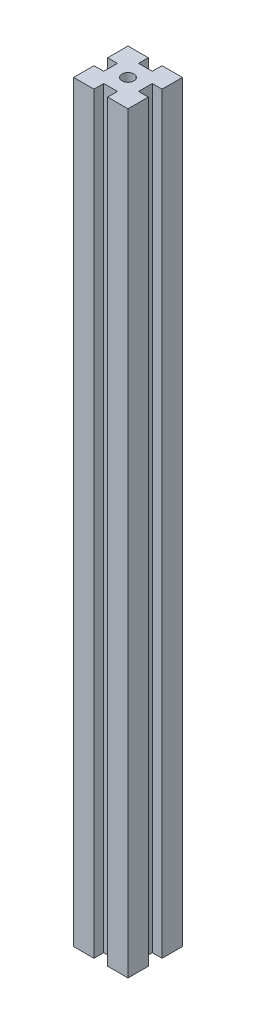
ISO-10303-21;
HEADER;
FILE_DESCRIPTION(('STEP AP214'),'2;1');
FILE_NAME('part.step','',(''),(''),'','','');
FILE_SCHEMA(('AUTOMOTIVE_DESIGN { 1 0 10303 214 1 1 1 1 }'));
ENDSEC;
DATA;
#1=APPLICATION_CONTEXT('core data for automotive mechanical design processes');
#2=APPLICATION_PROTOCOL_DEFINITION('international standard','automotive_design',2000,#1);
#3=PRODUCT_CONTEXT('',#1,'mechanical');
#4=PRODUCT('Part','Part','',(#3));
#5=PRODUCT_RELATED_PRODUCT_CATEGORY('part','',(#4));
#6=PRODUCT_DEFINITION_FORMATION('','',#4);
#7=PRODUCT_DEFINITION_CONTEXT('part definition',#1,'design');
#8=PRODUCT_DEFINITION('design','',#6,#7);
#9=PRODUCT_DEFINITION_SHAPE('','',#8);
#10=(LENGTH_UNIT() NAMED_UNIT(*) SI_UNIT(.MILLI.,.METRE.));
#11=(NAMED_UNIT(*) PLANE_ANGLE_UNIT() SI_UNIT($,.RADIAN.));
#12=(NAMED_UNIT(*) SI_UNIT($,.STERADIAN.) SOLID_ANGLE_UNIT());
#13=UNCERTAINTY_MEASURE_WITH_UNIT(LENGTH_MEASURE(1.E-05),#10,'distance_accuracy_value','');
#14=(GEOMETRIC_REPRESENTATION_CONTEXT(3) GLOBAL_UNCERTAINTY_ASSIGNED_CONTEXT((#13)) GLOBAL_UNIT_ASSIGNED_CONTEXT((#10,
#11,#12)) REPRESENTATION_CONTEXT('',''));
#15=CARTESIAN_POINT('',(0.,0.,0.));
#16=DIRECTION('',(0.,0.,1.));
#17=DIRECTION('',(1.,0.,0.));
#18=AXIS2_PLACEMENT_3D('',#15,#16,#17);
#19=CARTESIAN_POINT('',(0.,346.,0.));
#20=DIRECTION('',(0.,-1.,0.));
#21=DIRECTION('',(0.,0.,-1.));
#22=AXIS2_PLACEMENT_3D('',#19,#20,#21);
#23=PLANE('',#22);
#24=DIRECTION('',(0.,0.,1.));
#25=VECTOR('',#24,1.);
#26=CARTESIAN_POINT('',(0.,346.,0.));
#27=LINE('',#26,#25);
#28=CARTESIAN_POINT('',(1.2490009027033E-13,346.,-9.35000000000006));
#29=VERTEX_POINT('',#28);
#30=CARTESIAN_POINT('',(0.,346.,0.));
#31=VERTEX_POINT('',#30);
#32=EDGE_CURVE('E272',#29,#31,#27,.T.);
#33=ORIENTED_EDGE('',*,*,#32,.T.);
#34=DIRECTION('',(1.,0.,0.));
#35=VECTOR('',#34,1.);
#36=CARTESIAN_POINT('',(0.,346.,0.));
#37=LINE('',#36,#35);
#38=CARTESIAN_POINT('',(9.35000000000014,346.,-1.14491749414469E-13));
#39=VERTEX_POINT('',#38);
#40=EDGE_CURVE('E136',#31,#39,#37,.T.);
#41=ORIENTED_EDGE('',*,*,#40,.T.);
#42=DIRECTION('',(0.,0.,-1.));
#43=VECTOR('',#42,1.);
#44=CARTESIAN_POINT('',(9.34999999999994,346.,-4.49999999999992));
#45=LINE('',#44,#43);
#46=CARTESIAN_POINT('',(9.34999999999994,346.,-4.49999999999992));
#47=VERTEX_POINT('',#46);
#48=EDGE_CURVE('E341',#39,#47,#45,.T.);
#49=ORIENTED_EDGE('',*,*,#48,.T.);
#50=DIRECTION('',(1.,0.,0.));
#51=VECTOR('',#50,1.);
#52=CARTESIAN_POINT('',(15.6500000000002,346.,-4.50000000000007));
#53=LINE('',#52,#51);
#54=CARTESIAN_POINT('',(15.6500000000002,346.,-4.50000000000007));
#55=VERTEX_POINT('',#54);
#56=EDGE_CURVE('E361',#47,#55,#53,.T.);
#57=ORIENTED_EDGE('',*,*,#56,.T.);
#58=DIRECTION('',(0.,0.,1.));
#59=VECTOR('',#58,1.);
#60=CARTESIAN_POINT('',(15.6500000000001,346.,0.));
#61=LINE('',#60,#59);
#62=CARTESIAN_POINT('',(15.6500000000001,346.,0.));
#63=VERTEX_POINT('',#62);
#64=EDGE_CURVE('E357',#55,#63,#61,.T.);
#65=ORIENTED_EDGE('',*,*,#64,.T.);
#66=DIRECTION('',(1.,0.,0.));
#67=VECTOR('',#66,1.);
#68=CARTESIAN_POINT('',(15.6500000000001,346.,0.));
#69=LINE('',#68,#67);
#70=CARTESIAN_POINT('',(25.,346.,0.));
#71=VERTEX_POINT('',#70);
#72=EDGE_CURVE('E360',#63,#71,#69,.T.);
#73=ORIENTED_EDGE('',*,*,#72,.T.);
#74=DIRECTION('',(0.,0.,-1.));
#75=VECTOR('',#74,1.);
#76=CARTESIAN_POINT('',(25.,346.,0.));
#77=LINE('',#76,#75);
#78=CARTESIAN_POINT('',(25.0000000000001,346.,-9.35000000000012));
#79=VERTEX_POINT('',#78);
#80=EDGE_CURVE('E365',#71,#79,#77,.T.);
#81=ORIENTED_EDGE('',*,*,#80,.T.);
#82=DIRECTION('',(-1.,0.,0.));
#83=VECTOR('',#82,1.);
#84=CARTESIAN_POINT('',(20.5000000000001,346.,-9.35000000000013));
#85=LINE('',#84,#83);
#86=CARTESIAN_POINT('',(20.5000000000001,346.,-9.35000000000013));
#87=VERTEX_POINT('',#86);
#88=EDGE_CURVE('E372',#79,#87,#85,.T.);
#89=ORIENTED_EDGE('',*,*,#88,.T.);
#90=DIRECTION('',(0.,0.,-1.));
#91=VECTOR('',#90,1.);
#92=CARTESIAN_POINT('',(20.5000000000001,346.,-15.6500000000001));
#93=LINE('',#92,#91);
#94=CARTESIAN_POINT('',(20.5000000000001,346.,-15.6500000000001));
#95=VERTEX_POINT('',#94);
#96=EDGE_CURVE('E375',#87,#95,#93,.T.);
#97=ORIENTED_EDGE('',*,*,#96,.T.);
#98=DIRECTION('',(1.,0.,0.));
#99=VECTOR('',#98,1.);
#100=CARTESIAN_POINT('',(25.0000000000001,346.,-15.6500000000001));
#101=LINE('',#100,#99);
#102=CARTESIAN_POINT('',(25.0000000000001,346.,-15.6500000000001));
#103=VERTEX_POINT('',#102);
#104=EDGE_CURVE('E378',#95,#103,#101,.T.);
#105=ORIENTED_EDGE('',*,*,#104,.T.);
#106=DIRECTION('',(0.,0.,-1.));
#107=VECTOR('',#106,1.);
#108=CARTESIAN_POINT('',(25.0000000000001,346.,-15.6500000000001));
#109=LINE('',#108,#107);
#110=CARTESIAN_POINT('',(25.,346.,-25.));
#111=VERTEX_POINT('',#110);
#112=EDGE_CURVE('E381',#103,#111,#109,.T.);
#113=ORIENTED_EDGE('',*,*,#112,.T.);
#114=DIRECTION('',(-1.,0.,0.));
#115=VECTOR('',#114,1.);
#116=CARTESIAN_POINT('',(15.65,346.,-25.));
#117=LINE('',#116,#115);
#118=CARTESIAN_POINT('',(15.65,346.,-25.));
#119=VERTEX_POINT('',#118);
#120=EDGE_CURVE('E384',#111,#119,#117,.T.);
#121=ORIENTED_EDGE('',*,*,#120,.T.);
#122=DIRECTION('',(0.,0.,1.));
#123=VECTOR('',#122,1.);
#124=CARTESIAN_POINT('',(15.65,346.,-20.5));
#125=LINE('',#124,#123);
#126=CARTESIAN_POINT('',(15.65,346.,-20.5));
#127=VERTEX_POINT('',#126);
#128=EDGE_CURVE('E387',#119,#127,#125,.T.);
#129=ORIENTED_EDGE('',*,*,#128,.T.);
#130=DIRECTION('',(-1.,0.,0.));
#131=VECTOR('',#130,1.);
#132=CARTESIAN_POINT('',(9.35,346.,-20.5));
#133=LINE('',#132,#131);
#134=CARTESIAN_POINT('',(9.35,346.,-20.5));
#135=VERTEX_POINT('',#134);
#136=EDGE_CURVE('E390',#127,#135,#133,.T.);
#137=ORIENTED_EDGE('',*,*,#136,.T.);
#138=DIRECTION('',(0.,0.,-1.));
#139=VECTOR('',#138,1.);
#140=CARTESIAN_POINT('',(9.35,346.,-25.));
#141=LINE('',#140,#139);
#142=CARTESIAN_POINT('',(9.35,346.,-25.));
#143=VERTEX_POINT('',#142);
#144=EDGE_CURVE('E393',#135,#143,#141,.T.);
#145=ORIENTED_EDGE('',*,*,#144,.T.);
#146=DIRECTION('',(-1.,0.,0.));
#147=VECTOR('',#146,1.);
#148=CARTESIAN_POINT('',(0.,346.,-25.));
#149=LINE('',#148,#147);
#150=CARTESIAN_POINT('',(0.,346.,-25.));
#151=VERTEX_POINT('',#150);
#152=EDGE_CURVE('E396',#143,#151,#149,.T.);
#153=ORIENTED_EDGE('',*,*,#152,.T.);
#154=DIRECTION('',(0.,0.,1.));
#155=VECTOR('',#154,1.);
#156=CARTESIAN_POINT('',(1.90819582357449E-13,346.,-15.6500000000001));
#157=LINE('',#156,#155);
#158=CARTESIAN_POINT('',(1.90819582357449E-13,346.,-15.6500000000001));
#159=VERTEX_POINT('',#158);
#160=EDGE_CURVE('E191',#151,#159,#157,.T.);
#161=ORIENTED_EDGE('',*,*,#160,.T.);
#162=DIRECTION('',(1.,0.,0.));
#163=VECTOR('',#162,1.);
#164=CARTESIAN_POINT('',(4.50000000000019,346.,-15.65));
#165=LINE('',#164,#163);
#166=CARTESIAN_POINT('',(4.50000000000019,346.,-15.65));
#167=VERTEX_POINT('',#166);
#168=EDGE_CURVE('E185',#159,#167,#165,.T.);
#169=ORIENTED_EDGE('',*,*,#168,.T.);
#170=DIRECTION('',(0.,0.,1.));
#171=VECTOR('',#170,1.);
#172=CARTESIAN_POINT('',(4.50000000000013,346.,-9.35000000000002));
#173=LINE('',#172,#171);
#174=CARTESIAN_POINT('',(4.50000000000013,346.,-9.35000000000002));
#175=VERTEX_POINT('',#174);
#176=EDGE_CURVE('E189',#167,#175,#173,.T.);
#177=ORIENTED_EDGE('',*,*,#176,.T.);
#178=DIRECTION('',(-1.,0.,0.));
#179=VECTOR('',#178,1.);
#180=CARTESIAN_POINT('',(1.2490009027033E-13,346.,-9.35000000000006));
#181=LINE('',#180,#179);
#182=EDGE_CURVE('E57',#175,#29,#181,.T.);
#183=ORIENTED_EDGE('',*,*,#182,.T.);
#184=EDGE_LOOP('',(#33,#41,#49,#57,#65,#73,#81,#89,#97,#105,#113,#121,#129,#137,#145,#153,#161,
#169,#177,#183));
#185=FACE_BOUND('',#184,.T.);
#186=CARTESIAN_POINT('',(12.5,346.,-12.5));
#187=DIRECTION('',(0.,1.,0.));
#188=DIRECTION('',(0.,0.,1.));
#189=AXIS2_PLACEMENT_3D('',#186,#187,#188);
#190=CIRCLE('',#189,2.75);
#191=CARTESIAN_POINT('',(12.5,346.,-9.75));
#192=VERTEX_POINT('',#191);
#193=EDGE_CURVE('E218',#192,#192,#190,.T.);
#194=ORIENTED_EDGE('',*,*,#193,.F.);
#195=EDGE_LOOP('',(#194));
#196=FACE_BOUND('',#195,.T.);
#197=ADVANCED_FACE('F39',(#185,#196),#23,.F.);
#198=CARTESIAN_POINT('',(0.,0.,0.));
#199=DIRECTION('',(0.,-1.,0.));
#200=DIRECTION('',(0.,0.,-1.));
#201=AXIS2_PLACEMENT_3D('',#198,#199,#200);
#202=PLANE('',#201);
#203=DIRECTION('',(0.,0.,1.));
#204=VECTOR('',#203,1.);
#205=CARTESIAN_POINT('',(0.,0.,0.));
#206=LINE('',#205,#204);
#207=CARTESIAN_POINT('',(1.2490009027033E-13,0.,-9.35000000000006));
#208=VERTEX_POINT('',#207);
#209=CARTESIAN_POINT('',(0.,0.,0.));
#210=VERTEX_POINT('',#209);
#211=EDGE_CURVE('E213',#208,#210,#206,.T.);
#212=ORIENTED_EDGE('',*,*,#211,.F.);
#213=DIRECTION('',(-1.,0.,0.));
#214=VECTOR('',#213,1.);
#215=CARTESIAN_POINT('',(1.2490009027033E-13,0.,-9.35000000000006));
#216=LINE('',#215,#214);
#217=CARTESIAN_POINT('',(4.50000000000013,0.,-9.35000000000002));
#218=VERTEX_POINT('',#217);
#219=EDGE_CURVE('E128',#218,#208,#216,.T.);
#220=ORIENTED_EDGE('',*,*,#219,.F.);
#221=DIRECTION('',(0.,0.,1.));
#222=VECTOR('',#221,1.);
#223=CARTESIAN_POINT('',(4.50000000000013,0.,-9.35000000000002));
#224=LINE('',#223,#222);
#225=CARTESIAN_POINT('',(4.50000000000019,0.,-15.65));
#226=VERTEX_POINT('',#225);
#227=EDGE_CURVE('E122',#226,#218,#224,.T.);
#228=ORIENTED_EDGE('',*,*,#227,.F.);
#229=DIRECTION('',(1.,0.,0.));
#230=VECTOR('',#229,1.);
#231=CARTESIAN_POINT('',(4.50000000000019,0.,-15.65));
#232=LINE('',#231,#230);
#233=CARTESIAN_POINT('',(1.90819582357449E-13,0.,-15.6500000000001));
#234=VERTEX_POINT('',#233);
#235=EDGE_CURVE('E200',#234,#226,#232,.T.);
#236=ORIENTED_EDGE('',*,*,#235,.F.);
#237=DIRECTION('',(0.,0.,1.));
#238=VECTOR('',#237,1.);
#239=CARTESIAN_POINT('',(1.90819582357449E-13,0.,-15.6500000000001));
#240=LINE('',#239,#238);
#241=CARTESIAN_POINT('',(0.,0.,-25.));
#242=VERTEX_POINT('',#241);
#243=EDGE_CURVE('E263',#242,#234,#240,.T.);
#244=ORIENTED_EDGE('',*,*,#243,.F.);
#245=DIRECTION('',(-1.,0.,0.));
#246=VECTOR('',#245,1.);
#247=CARTESIAN_POINT('',(0.,0.,-25.));
#248=LINE('',#247,#246);
#249=CARTESIAN_POINT('',(9.35,0.,-25.));
#250=VERTEX_POINT('',#249);
#251=EDGE_CURVE('E260',#250,#242,#248,.T.);
#252=ORIENTED_EDGE('',*,*,#251,.F.);
#253=DIRECTION('',(0.,0.,-1.));
#254=VECTOR('',#253,1.);
#255=CARTESIAN_POINT('',(9.35,0.,-25.));
#256=LINE('',#255,#254);
#257=CARTESIAN_POINT('',(9.35,0.,-20.5));
#258=VERTEX_POINT('',#257);
#259=EDGE_CURVE('E257',#258,#250,#256,.T.);
#260=ORIENTED_EDGE('',*,*,#259,.F.);
#261=DIRECTION('',(-1.,0.,0.));
#262=VECTOR('',#261,1.);
#263=CARTESIAN_POINT('',(9.35,0.,-20.5));
#264=LINE('',#263,#262);
#265=CARTESIAN_POINT('',(15.65,0.,-20.5));
#266=VERTEX_POINT('',#265);
#267=EDGE_CURVE('E254',#266,#258,#264,.T.);
#268=ORIENTED_EDGE('',*,*,#267,.F.);
#269=DIRECTION('',(0.,0.,1.));
#270=VECTOR('',#269,1.);
#271=CARTESIAN_POINT('',(15.65,0.,-20.5));
#272=LINE('',#271,#270);
#273=CARTESIAN_POINT('',(15.65,0.,-25.));
#274=VERTEX_POINT('',#273);
#275=EDGE_CURVE('E251',#274,#266,#272,.T.);
#276=ORIENTED_EDGE('',*,*,#275,.F.);
#277=DIRECTION('',(-1.,0.,0.));
#278=VECTOR('',#277,1.);
#279=CARTESIAN_POINT('',(15.65,0.,-25.));
#280=LINE('',#279,#278);
#281=CARTESIAN_POINT('',(25.,0.,-25.));
#282=VERTEX_POINT('',#281);
#283=EDGE_CURVE('E248',#282,#274,#280,.T.);
#284=ORIENTED_EDGE('',*,*,#283,.F.);
#285=DIRECTION('',(0.,0.,-1.));
#286=VECTOR('',#285,1.);
#287=CARTESIAN_POINT('',(25.0000000000001,0.,-15.6500000000001));
#288=LINE('',#287,#286);
#289=CARTESIAN_POINT('',(25.0000000000001,0.,-15.6500000000001));
#290=VERTEX_POINT('',#289);
#291=EDGE_CURVE('E245',#290,#282,#288,.T.);
#292=ORIENTED_EDGE('',*,*,#291,.F.);
#293=DIRECTION('',(1.,0.,0.));
#294=VECTOR('',#293,1.);
#295=CARTESIAN_POINT('',(25.0000000000001,0.,-15.6500000000001));
#296=LINE('',#295,#294);
#297=CARTESIAN_POINT('',(20.5000000000001,0.,-15.6500000000001));
#298=VERTEX_POINT('',#297);
#299=EDGE_CURVE('E242',#298,#290,#296,.T.);
#300=ORIENTED_EDGE('',*,*,#299,.F.);
#301=DIRECTION('',(0.,0.,-1.));
#302=VECTOR('',#301,1.);
#303=CARTESIAN_POINT('',(20.5000000000001,0.,-15.6500000000001));
#304=LINE('',#303,#302);
#305=CARTESIAN_POINT('',(20.5000000000001,0.,-9.35000000000013));
#306=VERTEX_POINT('',#305);
#307=EDGE_CURVE('E239',#306,#298,#304,.T.);
#308=ORIENTED_EDGE('',*,*,#307,.F.);
#309=DIRECTION('',(-1.,0.,0.));
#310=VECTOR('',#309,1.);
#311=CARTESIAN_POINT('',(20.5000000000001,0.,-9.35000000000013));
#312=LINE('',#311,#310);
#313=CARTESIAN_POINT('',(25.0000000000001,0.,-9.35000000000012));
#314=VERTEX_POINT('',#313);
#315=EDGE_CURVE('E236',#314,#306,#312,.T.);
#316=ORIENTED_EDGE('',*,*,#315,.F.);
#317=DIRECTION('',(0.,0.,-1.));
#318=VECTOR('',#317,1.);
#319=CARTESIAN_POINT('',(25.,0.,0.));
#320=LINE('',#319,#318);
#321=CARTESIAN_POINT('',(25.,0.,0.));
#322=VERTEX_POINT('',#321);
#323=EDGE_CURVE('E233',#322,#314,#320,.T.);
#324=ORIENTED_EDGE('',*,*,#323,.F.);
#325=DIRECTION('',(1.,0.,0.));
#326=VECTOR('',#325,1.);
#327=CARTESIAN_POINT('',(15.6500000000001,0.,0.));
#328=LINE('',#327,#326);
#329=CARTESIAN_POINT('',(15.6500000000001,0.,0.));
#330=VERTEX_POINT('',#329);
#331=EDGE_CURVE('E230',#330,#322,#328,.T.);
#332=ORIENTED_EDGE('',*,*,#331,.F.);
#333=DIRECTION('',(0.,0.,1.));
#334=VECTOR('',#333,1.);
#335=CARTESIAN_POINT('',(15.6500000000001,0.,0.));
#336=LINE('',#335,#334);
#337=CARTESIAN_POINT('',(15.6500000000002,0.,-4.50000000000007));
#338=VERTEX_POINT('',#337);
#339=EDGE_CURVE('E227',#338,#330,#336,.T.);
#340=ORIENTED_EDGE('',*,*,#339,.F.);
#341=DIRECTION('',(1.,0.,0.));
#342=VECTOR('',#341,1.);
#343=CARTESIAN_POINT('',(15.6500000000002,0.,-4.50000000000007));
#344=LINE('',#343,#342);
#345=CARTESIAN_POINT('',(9.34999999999994,0.,-4.49999999999992));
#346=VERTEX_POINT('',#345);
#347=EDGE_CURVE('E224',#346,#338,#344,.T.);
#348=ORIENTED_EDGE('',*,*,#347,.F.);
#349=DIRECTION('',(0.,0.,-1.));
#350=VECTOR('',#349,1.);
#351=CARTESIAN_POINT('',(9.34999999999994,0.,-4.49999999999992));
#352=LINE('',#351,#350);
#353=CARTESIAN_POINT('',(9.35000000000014,0.,-1.14491749414469E-13));
#354=VERTEX_POINT('',#353);
#355=EDGE_CURVE('E221',#354,#346,#352,.T.);
#356=ORIENTED_EDGE('',*,*,#355,.F.);
#357=DIRECTION('',(1.,0.,0.));
#358=VECTOR('',#357,1.);
#359=CARTESIAN_POINT('',(0.,0.,0.));
#360=LINE('',#359,#358);
#361=EDGE_CURVE('E217',#210,#354,#360,.T.);
#362=ORIENTED_EDGE('',*,*,#361,.F.);
#363=EDGE_LOOP('',(#212,#220,#228,#236,#244,#252,#260,#268,#276,#284,#292,#300,#308,#316,#324,
#332,#340,#348,#356,#362));
#364=FACE_BOUND('',#363,.T.);
#365=CARTESIAN_POINT('',(12.5,0.,-12.5));
#366=DIRECTION('',(0.,1.,0.));
#367=DIRECTION('',(0.,0.,1.));
#368=AXIS2_PLACEMENT_3D('',#365,#366,#367);
#369=CIRCLE('',#368,2.75);
#370=CARTESIAN_POINT('',(12.5,0.,-9.75));
#371=VERTEX_POINT('',#370);
#372=EDGE_CURVE('E649',#371,#371,#369,.T.);
#373=ORIENTED_EDGE('',*,*,#372,.T.);
#374=EDGE_LOOP('',(#373));
#375=FACE_BOUND('',#374,.T.);
#376=ADVANCED_FACE('F345',(#364,#375),#202,.T.);
#377=CARTESIAN_POINT('',(0.,346.,0.));
#378=DIRECTION('',(1.,0.,0.));
#379=DIRECTION('',(0.,0.,-1.));
#380=AXIS2_PLACEMENT_3D('',#377,#378,#379);
#381=PLANE('',#380);
#382=ORIENTED_EDGE('',*,*,#211,.T.);
#383=DIRECTION('',(0.,-1.,0.));
#384=VECTOR('',#383,1.);
#385=CARTESIAN_POINT('',(0.,346.,0.));
#386=LINE('',#385,#384);
#387=EDGE_CURVE('E11',#31,#210,#386,.T.);
#388=ORIENTED_EDGE('',*,*,#387,.F.);
#389=ORIENTED_EDGE('',*,*,#32,.F.);
#390=DIRECTION('',(0.,-1.,0.));
#391=VECTOR('',#390,1.);
#392=CARTESIAN_POINT('',(1.2490009027033E-13,346.,-9.35000000000006));
#393=LINE('',#392,#391);
#394=EDGE_CURVE('E209',#29,#208,#393,.T.);
#395=ORIENTED_EDGE('',*,*,#394,.T.);
#396=EDGE_LOOP('',(#382,#388,#389,#395));
#397=FACE_BOUND('',#396,.T.);
#398=ADVANCED_FACE('F41',(#397),#381,.F.);
#399=CARTESIAN_POINT('',(0.,346.,0.));
#400=DIRECTION('',(0.,0.,-1.));
#401=DIRECTION('',(-1.,0.,0.));
#402=AXIS2_PLACEMENT_3D('',#399,#400,#401);
#403=PLANE('',#402);
#404=ORIENTED_EDGE('',*,*,#361,.T.);
#405=DIRECTION('',(0.,-1.,0.));
#406=VECTOR('',#405,1.);
#407=CARTESIAN_POINT('',(9.35000000000014,346.,-1.14491749414469E-13));
#408=LINE('',#407,#406);
#409=EDGE_CURVE('E49',#39,#354,#408,.T.);
#410=ORIENTED_EDGE('',*,*,#409,.F.);
#411=ORIENTED_EDGE('',*,*,#40,.F.);
#412=ORIENTED_EDGE('',*,*,#387,.T.);
#413=EDGE_LOOP('',(#404,#410,#411,#412));
#414=FACE_BOUND('',#413,.T.);
#415=ADVANCED_FACE('F432',(#414),#403,.F.);
#416=CARTESIAN_POINT('',(9.34999999999994,346.,-4.49999999999992));
#417=DIRECTION('',(-1.,0.,0.));
#418=DIRECTION('',(0.,0.,1.));
#419=AXIS2_PLACEMENT_3D('',#416,#417,#418);
#420=PLANE('',#419);
#421=ORIENTED_EDGE('',*,*,#355,.T.);
#422=DIRECTION('',(0.,-1.,0.));
#423=VECTOR('',#422,1.);
#424=CARTESIAN_POINT('',(9.34999999999994,346.,-4.49999999999992));
#425=LINE('',#424,#423);
#426=EDGE_CURVE('E331',#47,#346,#425,.T.);
#427=ORIENTED_EDGE('',*,*,#426,.F.);
#428=ORIENTED_EDGE('',*,*,#48,.F.);
#429=ORIENTED_EDGE('',*,*,#409,.T.);
#430=EDGE_LOOP('',(#421,#427,#428,#429));
#431=FACE_BOUND('',#430,.T.);
#432=ADVANCED_FACE('F339',(#431),#420,.F.);
#433=CARTESIAN_POINT('',(15.6500000000002,346.,-4.50000000000007));
#434=DIRECTION('',(0.,0.,-1.));
#435=DIRECTION('',(-1.,0.,0.));
#436=AXIS2_PLACEMENT_3D('',#433,#434,#435);
#437=PLANE('',#436);
#438=ORIENTED_EDGE('',*,*,#347,.T.);
#439=DIRECTION('',(0.,-1.,0.));
#440=VECTOR('',#439,1.);
#441=CARTESIAN_POINT('',(15.6500000000002,346.,-4.50000000000007));
#442=LINE('',#441,#440);
#443=EDGE_CURVE('E327',#55,#338,#442,.T.);
#444=ORIENTED_EDGE('',*,*,#443,.F.);
#445=ORIENTED_EDGE('',*,*,#56,.F.);
#446=ORIENTED_EDGE('',*,*,#426,.T.);
#447=EDGE_LOOP('',(#438,#444,#445,#446));
#448=FACE_BOUND('',#447,.T.);
#449=ADVANCED_FACE('F351',(#448),#437,.F.);
#450=CARTESIAN_POINT('',(15.6500000000001,346.,0.));
#451=DIRECTION('',(1.,0.,0.));
#452=DIRECTION('',(0.,0.,-1.));
#453=AXIS2_PLACEMENT_3D('',#450,#451,#452);
#454=PLANE('',#453);
#455=ORIENTED_EDGE('',*,*,#339,.T.);
#456=DIRECTION('',(0.,-1.,0.));
#457=VECTOR('',#456,1.);
#458=CARTESIAN_POINT('',(15.6500000000001,346.,0.));
#459=LINE('',#458,#457);
#460=EDGE_CURVE('E323',#63,#330,#459,.T.);
#461=ORIENTED_EDGE('',*,*,#460,.F.);
#462=ORIENTED_EDGE('',*,*,#64,.F.);
#463=ORIENTED_EDGE('',*,*,#443,.T.);
#464=EDGE_LOOP('',(#455,#461,#462,#463));
#465=FACE_BOUND('',#464,.T.);
#466=ADVANCED_FACE('F355',(#465),#454,.F.);
#467=CARTESIAN_POINT('',(15.6500000000001,346.,0.));
#468=DIRECTION('',(0.,0.,-1.));
#469=DIRECTION('',(-1.,0.,0.));
#470=AXIS2_PLACEMENT_3D('',#467,#468,#469);
#471=PLANE('',#470);
#472=ORIENTED_EDGE('',*,*,#331,.T.);
#473=DIRECTION('',(0.,-1.,0.));
#474=VECTOR('',#473,1.);
#475=CARTESIAN_POINT('',(25.,346.,0.));
#476=LINE('',#475,#474);
#477=EDGE_CURVE('E319',#71,#322,#476,.T.);
#478=ORIENTED_EDGE('',*,*,#477,.F.);
#479=ORIENTED_EDGE('',*,*,#72,.F.);
#480=ORIENTED_EDGE('',*,*,#460,.T.);
#481=EDGE_LOOP('',(#472,#478,#479,#480));
#482=FACE_BOUND('',#481,.T.);
#483=ADVANCED_FACE('F445',(#482),#471,.F.);
#484=CARTESIAN_POINT('',(25.,346.,0.));
#485=DIRECTION('',(-1.,0.,0.));
#486=DIRECTION('',(0.,0.,1.));
#487=AXIS2_PLACEMENT_3D('',#484,#485,#486);
#488=PLANE('',#487);
#489=ORIENTED_EDGE('',*,*,#323,.T.);
#490=DIRECTION('',(0.,-1.,0.));
#491=VECTOR('',#490,1.);
#492=CARTESIAN_POINT('',(25.0000000000001,346.,-9.35000000000012));
#493=LINE('',#492,#491);
#494=EDGE_CURVE('E315',#79,#314,#493,.T.);
#495=ORIENTED_EDGE('',*,*,#494,.F.);
#496=ORIENTED_EDGE('',*,*,#80,.F.);
#497=ORIENTED_EDGE('',*,*,#477,.T.);
#498=EDGE_LOOP('',(#489,#495,#496,#497));
#499=FACE_BOUND('',#498,.T.);
#500=ADVANCED_FACE('F448',(#499),#488,.F.);
#501=CARTESIAN_POINT('',(20.5000000000001,346.,-9.35000000000013));
#502=DIRECTION('',(0.,0.,1.));
#503=DIRECTION('',(1.,0.,0.));
#504=AXIS2_PLACEMENT_3D('',#501,#502,#503);
#505=PLANE('',#504);
#506=ORIENTED_EDGE('',*,*,#315,.T.);
#507=DIRECTION('',(0.,-1.,0.));
#508=VECTOR('',#507,1.);
#509=CARTESIAN_POINT('',(20.5000000000001,346.,-9.35000000000013));
#510=LINE('',#509,#508);
#511=EDGE_CURVE('E311',#87,#306,#510,.T.);
#512=ORIENTED_EDGE('',*,*,#511,.F.);
#513=ORIENTED_EDGE('',*,*,#88,.F.);
#514=ORIENTED_EDGE('',*,*,#494,.T.);
#515=EDGE_LOOP('',(#506,#512,#513,#514));
#516=FACE_BOUND('',#515,.T.);
#517=ADVANCED_FACE('F452',(#516),#505,.F.);
#518=CARTESIAN_POINT('',(20.5000000000001,346.,-15.6500000000001));
#519=DIRECTION('',(-1.,0.,0.));
#520=DIRECTION('',(0.,0.,1.));
#521=AXIS2_PLACEMENT_3D('',#518,#519,#520);
#522=PLANE('',#521);
#523=ORIENTED_EDGE('',*,*,#307,.T.);
#524=DIRECTION('',(0.,-1.,0.));
#525=VECTOR('',#524,1.);
#526=CARTESIAN_POINT('',(20.5000000000001,346.,-15.6500000000001));
#527=LINE('',#526,#525);
#528=EDGE_CURVE('E307',#95,#298,#527,.T.);
#529=ORIENTED_EDGE('',*,*,#528,.F.);
#530=ORIENTED_EDGE('',*,*,#96,.F.);
#531=ORIENTED_EDGE('',*,*,#511,.T.);
#532=EDGE_LOOP('',(#523,#529,#530,#531));
#533=FACE_BOUND('',#532,.T.);
#534=ADVANCED_FACE('F456',(#533),#522,.F.);
#535=CARTESIAN_POINT('',(25.0000000000001,346.,-15.6500000000001));
#536=DIRECTION('',(0.,0.,-1.));
#537=DIRECTION('',(-1.,0.,0.));
#538=AXIS2_PLACEMENT_3D('',#535,#536,#537);
#539=PLANE('',#538);
#540=ORIENTED_EDGE('',*,*,#299,.T.);
#541=DIRECTION('',(0.,-1.,0.));
#542=VECTOR('',#541,1.);
#543=CARTESIAN_POINT('',(25.0000000000001,346.,-15.6500000000001));
#544=LINE('',#543,#542);
#545=EDGE_CURVE('E303',#103,#290,#544,.T.);
#546=ORIENTED_EDGE('',*,*,#545,.F.);
#547=ORIENTED_EDGE('',*,*,#104,.F.);
#548=ORIENTED_EDGE('',*,*,#528,.T.);
#549=EDGE_LOOP('',(#540,#546,#547,#548));
#550=FACE_BOUND('',#549,.T.);
#551=ADVANCED_FACE('F460',(#550),#539,.F.);
#552=CARTESIAN_POINT('',(25.0000000000001,346.,-15.6500000000001));
#553=DIRECTION('',(-1.,0.,0.));
#554=DIRECTION('',(0.,0.,1.));
#555=AXIS2_PLACEMENT_3D('',#552,#553,#554);
#556=PLANE('',#555);
#557=ORIENTED_EDGE('',*,*,#291,.T.);
#558=DIRECTION('',(0.,-1.,0.));
#559=VECTOR('',#558,1.);
#560=CARTESIAN_POINT('',(25.,346.,-25.));
#561=LINE('',#560,#559);
#562=EDGE_CURVE('E299',#111,#282,#561,.T.);
#563=ORIENTED_EDGE('',*,*,#562,.F.);
#564=ORIENTED_EDGE('',*,*,#112,.F.);
#565=ORIENTED_EDGE('',*,*,#545,.T.);
#566=EDGE_LOOP('',(#557,#563,#564,#565));
#567=FACE_BOUND('',#566,.T.);
#568=ADVANCED_FACE('F464',(#567),#556,.F.);
#569=CARTESIAN_POINT('',(15.65,346.,-25.));
#570=DIRECTION('',(0.,0.,1.));
#571=DIRECTION('',(1.,0.,0.));
#572=AXIS2_PLACEMENT_3D('',#569,#570,#571);
#573=PLANE('',#572);
#574=ORIENTED_EDGE('',*,*,#283,.T.);
#575=DIRECTION('',(0.,-1.,0.));
#576=VECTOR('',#575,1.);
#577=CARTESIAN_POINT('',(15.65,346.,-25.));
#578=LINE('',#577,#576);
#579=EDGE_CURVE('E295',#119,#274,#578,.T.);
#580=ORIENTED_EDGE('',*,*,#579,.F.);
#581=ORIENTED_EDGE('',*,*,#120,.F.);
#582=ORIENTED_EDGE('',*,*,#562,.T.);
#583=EDGE_LOOP('',(#574,#580,#581,#582));
#584=FACE_BOUND('',#583,.T.);
#585=ADVANCED_FACE('F468',(#584),#573,.F.);
#586=CARTESIAN_POINT('',(15.65,346.,-20.5));
#587=DIRECTION('',(1.,0.,0.));
#588=DIRECTION('',(0.,0.,-1.));
#589=AXIS2_PLACEMENT_3D('',#586,#587,#588);
#590=PLANE('',#589);
#591=ORIENTED_EDGE('',*,*,#275,.T.);
#592=DIRECTION('',(0.,-1.,0.));
#593=VECTOR('',#592,1.);
#594=CARTESIAN_POINT('',(15.65,346.,-20.5));
#595=LINE('',#594,#593);
#596=EDGE_CURVE('E291',#127,#266,#595,.T.);
#597=ORIENTED_EDGE('',*,*,#596,.F.);
#598=ORIENTED_EDGE('',*,*,#128,.F.);
#599=ORIENTED_EDGE('',*,*,#579,.T.);
#600=EDGE_LOOP('',(#591,#597,#598,#599));
#601=FACE_BOUND('',#600,.T.);
#602=ADVANCED_FACE('F472',(#601),#590,.F.);
#603=CARTESIAN_POINT('',(9.35,346.,-20.5));
#604=DIRECTION('',(0.,0.,1.));
#605=DIRECTION('',(1.,0.,0.));
#606=AXIS2_PLACEMENT_3D('',#603,#604,#605);
#607=PLANE('',#606);
#608=ORIENTED_EDGE('',*,*,#267,.T.);
#609=DIRECTION('',(0.,-1.,0.));
#610=VECTOR('',#609,1.);
#611=CARTESIAN_POINT('',(9.35,346.,-20.5));
#612=LINE('',#611,#610);
#613=EDGE_CURVE('E287',#135,#258,#612,.T.);
#614=ORIENTED_EDGE('',*,*,#613,.F.);
#615=ORIENTED_EDGE('',*,*,#136,.F.);
#616=ORIENTED_EDGE('',*,*,#596,.T.);
#617=EDGE_LOOP('',(#608,#614,#615,#616));
#618=FACE_BOUND('',#617,.T.);
#619=ADVANCED_FACE('F476',(#618),#607,.F.);
#620=CARTESIAN_POINT('',(9.35,346.,-25.));
#621=DIRECTION('',(-1.,0.,0.));
#622=DIRECTION('',(0.,0.,1.));
#623=AXIS2_PLACEMENT_3D('',#620,#621,#622);
#624=PLANE('',#623);
#625=ORIENTED_EDGE('',*,*,#259,.T.);
#626=DIRECTION('',(0.,-1.,0.));
#627=VECTOR('',#626,1.);
#628=CARTESIAN_POINT('',(9.35,346.,-25.));
#629=LINE('',#628,#627);
#630=EDGE_CURVE('E283',#143,#250,#629,.T.);
#631=ORIENTED_EDGE('',*,*,#630,.F.);
#632=ORIENTED_EDGE('',*,*,#144,.F.);
#633=ORIENTED_EDGE('',*,*,#613,.T.);
#634=EDGE_LOOP('',(#625,#631,#632,#633));
#635=FACE_BOUND('',#634,.T.);
#636=ADVANCED_FACE('F480',(#635),#624,.F.);
#637=CARTESIAN_POINT('',(0.,346.,-25.));
#638=DIRECTION('',(0.,0.,1.));
#639=DIRECTION('',(1.,0.,0.));
#640=AXIS2_PLACEMENT_3D('',#637,#638,#639);
#641=PLANE('',#640);
#642=ORIENTED_EDGE('',*,*,#251,.T.);
#643=DIRECTION('',(0.,-1.,0.));
#644=VECTOR('',#643,1.);
#645=CARTESIAN_POINT('',(0.,346.,-25.));
#646=LINE('',#645,#644);
#647=EDGE_CURVE('E279',#151,#242,#646,.T.);
#648=ORIENTED_EDGE('',*,*,#647,.F.);
#649=ORIENTED_EDGE('',*,*,#152,.F.);
#650=ORIENTED_EDGE('',*,*,#630,.T.);
#651=EDGE_LOOP('',(#642,#648,#649,#650));
#652=FACE_BOUND('',#651,.T.);
#653=ADVANCED_FACE('F404',(#652),#641,.F.);
#654=CARTESIAN_POINT('',(1.90819582357449E-13,346.,-15.6500000000001));
#655=DIRECTION('',(1.,0.,0.));
#656=DIRECTION('',(0.,0.,-1.));
#657=AXIS2_PLACEMENT_3D('',#654,#655,#656);
#658=PLANE('',#657);
#659=ORIENTED_EDGE('',*,*,#243,.T.);
#660=DIRECTION('',(0.,-1.,0.));
#661=VECTOR('',#660,1.);
#662=CARTESIAN_POINT('',(1.90819582357449E-13,346.,-15.6500000000001));
#663=LINE('',#662,#661);
#664=EDGE_CURVE('E202',#159,#234,#663,.T.);
#665=ORIENTED_EDGE('',*,*,#664,.F.);
#666=ORIENTED_EDGE('',*,*,#160,.F.);
#667=ORIENTED_EDGE('',*,*,#647,.T.);
#668=EDGE_LOOP('',(#659,#665,#666,#667));
#669=FACE_BOUND('',#668,.T.);
#670=ADVANCED_FACE('F408',(#669),#658,.F.);
#671=CARTESIAN_POINT('',(4.50000000000019,346.,-15.65));
#672=DIRECTION('',(0.,0.,-1.));
#673=DIRECTION('',(-1.,0.,0.));
#674=AXIS2_PLACEMENT_3D('',#671,#672,#673);
#675=PLANE('',#674);
#676=ORIENTED_EDGE('',*,*,#235,.T.);
#677=DIRECTION('',(0.,-1.,0.));
#678=VECTOR('',#677,1.);
#679=CARTESIAN_POINT('',(4.50000000000019,346.,-15.65));
#680=LINE('',#679,#678);
#681=EDGE_CURVE('E197',#167,#226,#680,.T.);
#682=ORIENTED_EDGE('',*,*,#681,.F.);
#683=ORIENTED_EDGE('',*,*,#168,.F.);
#684=ORIENTED_EDGE('',*,*,#664,.T.);
#685=EDGE_LOOP('',(#676,#682,#683,#684));
#686=FACE_BOUND('',#685,.T.);
#687=ADVANCED_FACE('F198',(#686),#675,.F.);
#688=CARTESIAN_POINT('',(4.50000000000013,346.,-9.35000000000002));
#689=DIRECTION('',(1.,0.,0.));
#690=DIRECTION('',(0.,0.,-1.));
#691=AXIS2_PLACEMENT_3D('',#688,#689,#690);
#692=PLANE('',#691);
#693=ORIENTED_EDGE('',*,*,#227,.T.);
#694=DIRECTION('',(0.,-1.,0.));
#695=VECTOR('',#694,1.);
#696=CARTESIAN_POINT('',(4.50000000000013,346.,-9.35000000000002));
#697=LINE('',#696,#695);
#698=EDGE_CURVE('E203',#175,#218,#697,.T.);
#699=ORIENTED_EDGE('',*,*,#698,.F.);
#700=ORIENTED_EDGE('',*,*,#176,.F.);
#701=ORIENTED_EDGE('',*,*,#681,.T.);
#702=EDGE_LOOP('',(#693,#699,#700,#701));
#703=FACE_BOUND('',#702,.T.);
#704=ADVANCED_FACE('F205',(#703),#692,.F.);
#705=CARTESIAN_POINT('',(1.2490009027033E-13,346.,-9.35000000000006));
#706=DIRECTION('',(0.,0.,1.));
#707=DIRECTION('',(1.,0.,0.));
#708=AXIS2_PLACEMENT_3D('',#705,#706,#707);
#709=PLANE('',#708);
#710=ORIENTED_EDGE('',*,*,#219,.T.);
#711=ORIENTED_EDGE('',*,*,#394,.F.);
#712=ORIENTED_EDGE('',*,*,#182,.F.);
#713=ORIENTED_EDGE('',*,*,#698,.T.);
#714=EDGE_LOOP('',(#710,#711,#712,#713));
#715=FACE_BOUND('',#714,.T.);
#716=ADVANCED_FACE('F412',(#715),#709,.F.);
#717=CARTESIAN_POINT('',(12.5,346.,-12.5));
#718=DIRECTION('',(0.,-1.,0.));
#719=DIRECTION('',(0.,0.,-1.));
#720=AXIS2_PLACEMENT_3D('',#717,#718,#719);
#721=CYLINDRICAL_SURFACE('',#720,2.75);
#722=ORIENTED_EDGE('',*,*,#193,.T.);
#723=EDGE_LOOP('',(#722));
#724=FACE_BOUND('',#723,.T.);
#725=ORIENTED_EDGE('',*,*,#372,.F.);
#726=EDGE_LOOP('',(#725));
#727=FACE_BOUND('',#726,.T.);
#728=ADVANCED_FACE('F414',(#724,#727),#721,.F.);
#729=CLOSED_SHELL('',(#197,#376,#398,#415,#432,#449,#466,#483,#500,#517,#534,#551,#568,#585,
#602,#619,#636,#653,#670,#687,#704,#716,#728));
#730=MANIFOLD_SOLID_BREP('B2',#729);
#731=ADVANCED_BREP_SHAPE_REPRESENTATION('',(#18,#730),#14);
#732=SHAPE_DEFINITION_REPRESENTATION(#9,#731);
ENDSEC;
END-ISO-10303-21;
